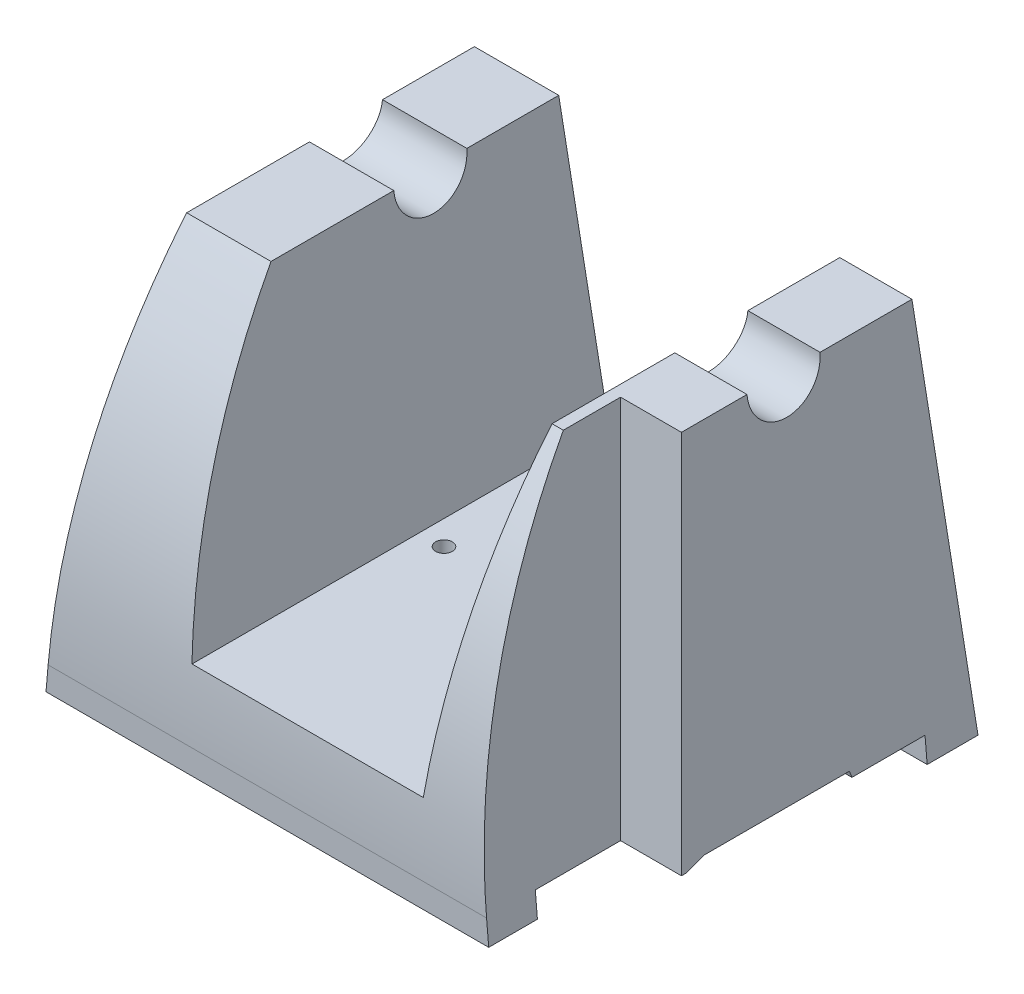
ISO-10303-21;
HEADER;
FILE_DESCRIPTION(('STEP AP214'),'2;1');
FILE_NAME('part.step','',(''),(''),'','','');
FILE_SCHEMA(('AUTOMOTIVE_DESIGN { 1 0 10303 214 1 1 1 1 }'));
ENDSEC;
DATA;
#1=APPLICATION_CONTEXT('core data for automotive mechanical design processes');
#2=APPLICATION_PROTOCOL_DEFINITION('international standard','automotive_design',2000,#1);
#3=PRODUCT_CONTEXT('',#1,'mechanical');
#4=PRODUCT('Part','Part','',(#3));
#5=PRODUCT_RELATED_PRODUCT_CATEGORY('part','',(#4));
#6=PRODUCT_DEFINITION_FORMATION('','',#4);
#7=PRODUCT_DEFINITION_CONTEXT('part definition',#1,'design');
#8=PRODUCT_DEFINITION('design','',#6,#7);
#9=PRODUCT_DEFINITION_SHAPE('','',#8);
#10=(LENGTH_UNIT() NAMED_UNIT(*) SI_UNIT(.MILLI.,.METRE.));
#11=(NAMED_UNIT(*) PLANE_ANGLE_UNIT() SI_UNIT($,.RADIAN.));
#12=(NAMED_UNIT(*) SI_UNIT($,.STERADIAN.) SOLID_ANGLE_UNIT());
#13=UNCERTAINTY_MEASURE_WITH_UNIT(LENGTH_MEASURE(1.E-05),#10,'distance_accuracy_value','');
#14=(GEOMETRIC_REPRESENTATION_CONTEXT(3) GLOBAL_UNCERTAINTY_ASSIGNED_CONTEXT((#13)) GLOBAL_UNIT_ASSIGNED_CONTEXT((#10,
#11,#12)) REPRESENTATION_CONTEXT('',''));
#15=CARTESIAN_POINT('',(0.,0.,0.));
#16=DIRECTION('',(0.,0.,1.));
#17=DIRECTION('',(1.,0.,0.));
#18=AXIS2_PLACEMENT_3D('',#15,#16,#17);
#19=CARTESIAN_POINT('',(130.175,98.425,-79.1170571106695));
#20=DIRECTION('',(0.,-1.,0.));
#21=DIRECTION('',(0.,0.,-1.));
#22=AXIS2_PLACEMENT_3D('',#19,#20,#21);
#23=PLANE('',#22);
#24=DIRECTION('',(1.,0.,0.));
#25=VECTOR('',#24,1.);
#26=CARTESIAN_POINT('',(130.175,98.425,-103.069481305851));
#27=LINE('',#26,#25);
#28=CARTESIAN_POINT('',(122.119481305851,98.425,-103.069481305851));
#29=VERTEX_POINT('',#28);
#30=CARTESIAN_POINT('',(103.305518694149,98.425,-103.069481305851));
#31=VERTEX_POINT('',#30);
#32=EDGE_CURVE('E272',#29,#31,#27,.F.);
#33=ORIENTED_EDGE('',*,*,#32,.T.);
#34=DIRECTION('',(0.,0.,1.));
#35=VECTOR('',#34,1.);
#36=CARTESIAN_POINT('',(103.305518694149,98.425,-36.1749068721041));
#37=LINE('',#36,#35);
#38=CARTESIAN_POINT('',(103.305518694149,98.425,-79.1170571106695));
#39=VERTEX_POINT('',#38);
#40=EDGE_CURVE('E268',#39,#31,#37,.F.);
#41=ORIENTED_EDGE('',*,*,#40,.F.);
#42=DIRECTION('',(-1.,0.,0.));
#43=VECTOR('',#42,1.);
#44=CARTESIAN_POINT('',(130.175,98.425,-79.1170571106695));
#45=LINE('',#44,#43);
#46=CARTESIAN_POINT('',(122.119481305851,98.425,-79.1170571106695));
#47=VERTEX_POINT('',#46);
#48=EDGE_CURVE('E273',#47,#39,#45,.T.);
#49=ORIENTED_EDGE('',*,*,#48,.F.);
#50=DIRECTION('',(0.,0.,-1.));
#51=VECTOR('',#50,1.);
#52=CARTESIAN_POINT('',(122.119481305851,98.425,-36.1749068721041));
#53=LINE('',#52,#51);
#54=EDGE_CURVE('E342',#29,#47,#53,.F.);
#55=ORIENTED_EDGE('',*,*,#54,.F.);
#56=EDGE_LOOP('',(#33,#41,#49,#55));
#57=FACE_BOUND('',#56,.T.);
#58=ADVANCED_FACE('F45',(#57),#23,.F.);
#59=CARTESIAN_POINT('',(130.175,98.425,-69.5920571106695));
#60=DIRECTION('',(-1.,0.,0.));
#61=DIRECTION('',(0.,0.,1.));
#62=AXIS2_PLACEMENT_3D('',#59,#60,#61);
#63=CYLINDRICAL_SURFACE('',#62,9.52500000000001);
#64=ORIENTED_EDGE('',*,*,#48,.T.);
#65=CARTESIAN_POINT('',(103.305518694149,98.425,-69.5920571106695));
#66=DIRECTION('',(-0.996194698091746,0.0871557427476582,0.));
#67=DIRECTION('',(-0.0871557427476582,-0.996194698091746,0.));
#68=AXIS2_PLACEMENT_3D('',#65,#66,#67);
#69=ELLIPSE('',#68,9.56138395260039,9.52500000000001);
#70=CARTESIAN_POINT('',(103.305518694149,98.425,-60.0670571106695));
#71=VERTEX_POINT('',#70);
#72=EDGE_CURVE('E250',#39,#71,#69,.T.);
#73=ORIENTED_EDGE('',*,*,#72,.T.);
#74=DIRECTION('',(-1.,0.,0.));
#75=VECTOR('',#74,1.);
#76=CARTESIAN_POINT('',(130.175,98.425,-60.0670571106695));
#77=LINE('',#76,#75);
#78=CARTESIAN_POINT('',(122.119481305851,98.425,-60.0670571106695));
#79=VERTEX_POINT('',#78);
#80=EDGE_CURVE('E373',#79,#71,#77,.T.);
#81=ORIENTED_EDGE('',*,*,#80,.F.);
#82=CARTESIAN_POINT('',(122.119481305851,98.425,-69.5920571106695));
#83=DIRECTION('',(0.996194698091746,0.0871557427476582,0.));
#84=DIRECTION('',(-0.0871557427476582,0.996194698091746,0.));
#85=AXIS2_PLACEMENT_3D('',#82,#83,#84);
#86=ELLIPSE('',#85,9.56138395260039,9.52500000000001);
#87=EDGE_CURVE('E340',#47,#79,#86,.F.);
#88=ORIENTED_EDGE('',*,*,#87,.F.);
#89=EDGE_LOOP('',(#64,#73,#81,#88));
#90=FACE_BOUND('',#89,.T.);
#91=ADVANCED_FACE('F371',(#90),#63,.F.);
#92=CARTESIAN_POINT('',(130.175,98.425,-28.059114221339));
#93=DIRECTION('',(0.,-1.,0.));
#94=DIRECTION('',(0.,0.,-1.));
#95=AXIS2_PLACEMENT_3D('',#92,#93,#94);
#96=PLANE('',#95);
#97=DIRECTION('',(-1.,0.,0.));
#98=VECTOR('',#97,1.);
#99=CARTESIAN_POINT('',(130.175,98.425,-28.059114221339));
#100=LINE('',#99,#98);
#101=CARTESIAN_POINT('',(106.244481305851,98.425,-28.059114221339));
#102=VERTEX_POINT('',#101);
#103=CARTESIAN_POINT('',(103.305518694149,98.425,-28.059114221339));
#104=VERTEX_POINT('',#103);
#105=EDGE_CURVE('E445',#102,#104,#100,.T.);
#106=ORIENTED_EDGE('',*,*,#105,.F.);
#107=DIRECTION('',(0.,0.,-1.));
#108=VECTOR('',#107,1.);
#109=CARTESIAN_POINT('',(106.244481305851,98.425,-36.1749068721041));
#110=LINE('',#109,#108);
#111=CARTESIAN_POINT('',(106.244481305851,98.425,-42.9805186941495));
#112=VERTEX_POINT('',#111);
#113=EDGE_CURVE('E328',#112,#102,#110,.F.);
#114=ORIENTED_EDGE('',*,*,#113,.F.);
#115=DIRECTION('',(1.,0.,0.));
#116=VECTOR('',#115,1.);
#117=CARTESIAN_POINT('',(130.175,98.425,-42.9805186941495));
#118=LINE('',#117,#116);
#119=CARTESIAN_POINT('',(122.119481305851,98.425,-42.9805186941495));
#120=VERTEX_POINT('',#119);
#121=EDGE_CURVE('E333',#120,#112,#118,.F.);
#122=ORIENTED_EDGE('',*,*,#121,.F.);
#123=DIRECTION('',(0.,0.,-1.));
#124=VECTOR('',#123,1.);
#125=CARTESIAN_POINT('',(122.119481305851,98.425,-36.1749068721041));
#126=LINE('',#125,#124);
#127=EDGE_CURVE('E337',#79,#120,#126,.F.);
#128=ORIENTED_EDGE('',*,*,#127,.F.);
#129=ORIENTED_EDGE('',*,*,#80,.T.);
#130=DIRECTION('',(0.,0.,1.));
#131=VECTOR('',#130,1.);
#132=CARTESIAN_POINT('',(103.305518694149,98.425,-36.1749068721041));
#133=LINE('',#132,#131);
#134=EDGE_CURVE('E346',#104,#71,#133,.F.);
#135=ORIENTED_EDGE('',*,*,#134,.F.);
#136=EDGE_LOOP('',(#106,#114,#122,#128,#129,#135));
#137=FACE_BOUND('',#136,.T.);
#138=ADVANCED_FACE('F378',(#137),#96,.F.);
#139=CARTESIAN_POINT('',(130.175,0.,-12.7));
#140=DIRECTION('',(0.,1.,0.));
#141=DIRECTION('',(0.,0.,1.));
#142=AXIS2_PLACEMENT_3D('',#139,#140,#141);
#143=PLANE('',#142);
#144=DIRECTION('',(-1.,0.,0.));
#145=VECTOR('',#144,1.);
#146=CARTESIAN_POINT('',(130.175,0.,-12.7));
#147=LINE('',#146,#145);
#148=CARTESIAN_POINT('',(114.85555301339,0.,-12.7));
#149=VERTEX_POINT('',#148);
#150=CARTESIAN_POINT('',(-0.555553013389637,0.,-12.7));
#151=VERTEX_POINT('',#150);
#152=EDGE_CURVE('E137',#149,#151,#147,.T.);
#153=ORIENTED_EDGE('',*,*,#152,.F.);
#154=DIRECTION('',(0.,0.,-1.));
#155=VECTOR('',#154,1.);
#156=CARTESIAN_POINT('',(114.85555301339,0.,-12.7));
#157=LINE('',#156,#155);
#158=CARTESIAN_POINT('',(114.85555301339,0.,0.));
#159=VERTEX_POINT('',#158);
#160=EDGE_CURVE('E263',#149,#159,#157,.F.);
#161=ORIENTED_EDGE('',*,*,#160,.T.);
#162=DIRECTION('',(-1.,0.,0.));
#163=VECTOR('',#162,1.);
#164=CARTESIAN_POINT('',(130.175,0.,0.));
#165=LINE('',#164,#163);
#166=CARTESIAN_POINT('',(-0.555553013389637,0.,0.));
#167=VERTEX_POINT('',#166);
#168=EDGE_CURVE('E196',#159,#167,#165,.T.);
#169=ORIENTED_EDGE('',*,*,#168,.T.);
#170=DIRECTION('',(0.,0.,-1.));
#171=VECTOR('',#170,1.);
#172=CARTESIAN_POINT('',(-0.555553013389618,0.,-36.1749068721041));
#173=LINE('',#172,#171);
#174=EDGE_CURVE('E236',#167,#151,#173,.T.);
#175=ORIENTED_EDGE('',*,*,#174,.T.);
#176=EDGE_LOOP('',(#153,#161,#169,#175));
#177=FACE_BOUND('',#176,.T.);
#178=ADVANCED_FACE('F453',(#177),#143,.F.);
#179=CARTESIAN_POINT('',(130.175,6.35,-12.7));
#180=DIRECTION('',(0.,0.,1.));
#181=DIRECTION('',(1.,0.,0.));
#182=AXIS2_PLACEMENT_3D('',#179,#180,#181);
#183=PLANE('',#182);
#184=DIRECTION('',(-1.,0.,0.));
#185=VECTOR('',#184,1.);
#186=CARTESIAN_POINT('',(130.175,6.35,-12.7));
#187=LINE('',#186,#185);
#188=CARTESIAN_POINT('',(114.3,6.35,-12.7));
#189=VERTEX_POINT('',#188);
#190=CARTESIAN_POINT('',(0.,6.35,-12.7));
#191=VERTEX_POINT('',#190);
#192=EDGE_CURVE('E391',#189,#191,#187,.T.);
#193=ORIENTED_EDGE('',*,*,#192,.F.);
#194=DIRECTION('',(-0.0871557427476582,0.996194698091746,0.));
#195=VECTOR('',#194,1.);
#196=CARTESIAN_POINT('',(114.420588460466,4.97166758976874,-12.7));
#197=LINE('',#196,#195);
#198=EDGE_CURVE('E244',#189,#149,#197,.F.);
#199=ORIENTED_EDGE('',*,*,#198,.T.);
#200=ORIENTED_EDGE('',*,*,#152,.T.);
#201=DIRECTION('',(0.0871557427476582,0.996194698091746,0.));
#202=VECTOR('',#201,1.);
#203=CARTESIAN_POINT('',(0.,6.35,-12.7));
#204=LINE('',#203,#202);
#205=EDGE_CURVE('E288',#151,#191,#204,.T.);
#206=ORIENTED_EDGE('',*,*,#205,.T.);
#207=EDGE_LOOP('',(#193,#199,#200,#206));
#208=FACE_BOUND('',#207,.T.);
#209=ADVANCED_FACE('F451',(#208),#183,.F.);
#210=CARTESIAN_POINT('',(130.175,6.35,-36.1749068721041));
#211=DIRECTION('',(0.,1.,0.));
#212=DIRECTION('',(0.,0.,1.));
#213=AXIS2_PLACEMENT_3D('',#210,#211,#212);
#214=PLANE('',#213);
#215=DIRECTION('',(1.,0.,0.));
#216=VECTOR('',#215,1.);
#217=CARTESIAN_POINT('',(130.175,6.35,-34.925));
#218=LINE('',#217,#216);
#219=CARTESIAN_POINT('',(130.175,6.35,-34.925));
#220=VERTEX_POINT('',#219);
#221=CARTESIAN_POINT('',(114.3,6.35,-34.925));
#222=VERTEX_POINT('',#221);
#223=EDGE_CURVE('E64',#220,#222,#218,.F.);
#224=ORIENTED_EDGE('',*,*,#223,.T.);
#225=DIRECTION('',(0.,0.,-1.));
#226=VECTOR('',#225,1.);
#227=CARTESIAN_POINT('',(114.3,6.35,-36.1749068721041));
#228=LINE('',#227,#226);
#229=EDGE_CURVE('E323',#222,#189,#228,.F.);
#230=ORIENTED_EDGE('',*,*,#229,.T.);
#231=ORIENTED_EDGE('',*,*,#192,.T.);
#232=DIRECTION('',(0.,0.,-1.));
#233=VECTOR('',#232,1.);
#234=CARTESIAN_POINT('',(0.,6.35,-36.1749068721041));
#235=LINE('',#234,#233);
#236=CARTESIAN_POINT('',(0.,6.35,-36.1749068721041));
#237=VERTEX_POINT('',#236);
#238=EDGE_CURVE('E290',#191,#237,#235,.T.);
#239=ORIENTED_EDGE('',*,*,#238,.T.);
#240=DIRECTION('',(-1.,0.,0.));
#241=VECTOR('',#240,1.);
#242=CARTESIAN_POINT('',(130.175,6.35,-36.1749068721041));
#243=LINE('',#242,#241);
#244=CARTESIAN_POINT('',(130.175,6.35,-36.1749068721041));
#245=VERTEX_POINT('',#244);
#246=EDGE_CURVE('E387',#245,#237,#243,.T.);
#247=ORIENTED_EDGE('',*,*,#246,.F.);
#248=DIRECTION('',(0.,0.,1.));
#249=VECTOR('',#248,1.);
#250=CARTESIAN_POINT('',(130.175,6.35,-36.1749068721041));
#251=LINE('',#250,#249);
#252=EDGE_CURVE('E188',#220,#245,#251,.F.);
#253=ORIENTED_EDGE('',*,*,#252,.F.);
#254=EDGE_LOOP('',(#224,#230,#231,#239,#247,#253));
#255=FACE_BOUND('',#254,.T.);
#256=ADVANCED_FACE('F384',(#255),#214,.F.);
#257=CARTESIAN_POINT('',(130.175,7.9375,-40.8807953947292));
#258=DIRECTION('',(0.,0.947537254746192,0.319645351707248));
#259=DIRECTION('',(0.,-0.319645351707248,0.947537254746192));
#260=AXIS2_PLACEMENT_3D('',#257,#258,#259);
#261=PLANE('',#260);
#262=DIRECTION('',(0.0279544157373131,0.319520433970623,-0.947166956199386));
#263=VECTOR('',#262,1.);
#264=CARTESIAN_POINT('',(0.,6.35,-36.1749068721041));
#265=LINE('',#264,#263);
#266=CARTESIAN_POINT('',(0.138888253347402,7.9375,-40.8807953947292));
#267=VERTEX_POINT('',#266);
#268=EDGE_CURVE('E292',#237,#267,#265,.T.);
#269=ORIENTED_EDGE('',*,*,#268,.T.);
#270=DIRECTION('',(-1.,0.,0.));
#271=VECTOR('',#270,1.);
#272=CARTESIAN_POINT('',(130.175,7.9375,-40.8807953947292));
#273=LINE('',#272,#271);
#274=CARTESIAN_POINT('',(130.036111746653,7.9375,-40.8807953947292));
#275=VERTEX_POINT('',#274);
#276=EDGE_CURVE('E392',#275,#267,#273,.T.);
#277=ORIENTED_EDGE('',*,*,#276,.F.);
#278=DIRECTION('',(0.0279544157373131,-0.319520433970623,0.947166956199386));
#279=VECTOR('',#278,1.);
#280=CARTESIAN_POINT('',(130.175,6.35,-36.1749068721041));
#281=LINE('',#280,#279);
#282=EDGE_CURVE('E185',#245,#275,#281,.F.);
#283=ORIENTED_EDGE('',*,*,#282,.F.);
#284=ORIENTED_EDGE('',*,*,#246,.T.);
#285=EDGE_LOOP('',(#269,#277,#283,#284));
#286=FACE_BOUND('',#285,.T.);
#287=ADVANCED_FACE('F394',(#286),#261,.F.);
#288=CARTESIAN_POINT('',(130.175,7.93750000000001,-78.8394674989891));
#289=DIRECTION('',(0.,1.,0.));
#290=DIRECTION('',(0.,0.,1.));
#291=AXIS2_PLACEMENT_3D('',#288,#289,#290);
#292=PLANE('',#291);
#293=CARTESIAN_POINT('',(42.8697084867889,7.93750000000001,-60.325));
#294=DIRECTION('',(0.,1.,0.));
#295=DIRECTION('',(0.,0.,1.));
#296=AXIS2_PLACEMENT_3D('',#293,#294,#295);
#297=CIRCLE('',#296,2.17842895301002);
#298=CARTESIAN_POINT('',(42.8697084867889,7.93750000000001,-58.14657104699));
#299=VERTEX_POINT('',#298);
#300=EDGE_CURVE('E336',#299,#299,#297,.T.);
#301=ORIENTED_EDGE('',*,*,#300,.T.);
#302=EDGE_LOOP('',(#301));
#303=FACE_BOUND('',#302,.T.);
#304=DIRECTION('',(0.,0.,-1.));
#305=VECTOR('',#304,1.);
#306=CARTESIAN_POINT('',(0.138888253347405,7.9375,-36.1749068721041));
#307=LINE('',#306,#305);
#308=CARTESIAN_POINT('',(0.138888253347402,7.93750000000001,-78.8394674989891));
#309=VERTEX_POINT('',#308);
#310=EDGE_CURVE('E294',#267,#309,#307,.T.);
#311=ORIENTED_EDGE('',*,*,#310,.T.);
#312=DIRECTION('',(-1.,0.,0.));
#313=VECTOR('',#312,1.);
#314=CARTESIAN_POINT('',(130.175,7.93750000000001,-78.8394674989891));
#315=LINE('',#314,#313);
#316=CARTESIAN_POINT('',(130.036111746653,7.93750000000001,-78.8394674989891));
#317=VERTEX_POINT('',#316);
#318=EDGE_CURVE('E399',#317,#309,#315,.T.);
#319=ORIENTED_EDGE('',*,*,#318,.F.);
#320=DIRECTION('',(0.,0.,1.));
#321=VECTOR('',#320,1.);
#322=CARTESIAN_POINT('',(130.036111746653,7.9375,-36.1749068721041));
#323=LINE('',#322,#321);
#324=EDGE_CURVE('E317',#275,#317,#323,.F.);
#325=ORIENTED_EDGE('',*,*,#324,.F.);
#326=ORIENTED_EDGE('',*,*,#276,.T.);
#327=EDGE_LOOP('',(#311,#319,#325,#326));
#328=FACE_BOUND('',#327,.T.);
#329=ADVANCED_FACE('F402',(#303,#328),#292,.F.);
#330=CARTESIAN_POINT('',(130.175,6.34999999999999,-79.375));
#331=DIRECTION('',(0.,0.319645351707247,-0.947537254746192));
#332=DIRECTION('',(0.,0.947537254746192,0.319645351707247));
#333=AXIS2_PLACEMENT_3D('',#330,#331,#332);
#334=PLANE('',#333);
#335=DIRECTION('',(-0.0826153791601821,-0.94429810481334,-0.318552646154687));
#336=VECTOR('',#335,1.);
#337=CARTESIAN_POINT('',(1.13691186912372,19.3449621277143,-74.9912364920963));
#338=LINE('',#337,#336);
#339=CARTESIAN_POINT('',(0.,6.34999999999999,-79.375));
#340=VERTEX_POINT('',#339);
#341=EDGE_CURVE('E296',#309,#340,#338,.T.);
#342=ORIENTED_EDGE('',*,*,#341,.T.);
#343=DIRECTION('',(-1.,0.,0.));
#344=VECTOR('',#343,1.);
#345=CARTESIAN_POINT('',(130.175,6.34999999999999,-79.375));
#346=LINE('',#345,#344);
#347=CARTESIAN_POINT('',(130.175,6.34999999999999,-79.375));
#348=VERTEX_POINT('',#347);
#349=EDGE_CURVE('E410',#348,#340,#346,.T.);
#350=ORIENTED_EDGE('',*,*,#349,.F.);
#351=DIRECTION('',(-0.0826153791601821,0.94429810481334,0.318552646154687));
#352=VECTOR('',#351,1.);
#353=CARTESIAN_POINT('',(129.038088130876,19.3449621277143,-74.9912364920963));
#354=LINE('',#353,#352);
#355=EDGE_CURVE('E315',#317,#348,#354,.F.);
#356=ORIENTED_EDGE('',*,*,#355,.F.);
#357=ORIENTED_EDGE('',*,*,#318,.T.);
#358=EDGE_LOOP('',(#342,#350,#356,#357));
#359=FACE_BOUND('',#358,.T.);
#360=ADVANCED_FACE('F411',(#359),#334,.F.);
#361=CARTESIAN_POINT('',(130.175,6.34999999999999,-98.425));
#362=DIRECTION('',(0.,1.,0.));
#363=DIRECTION('',(0.,0.,1.));
#364=AXIS2_PLACEMENT_3D('',#361,#362,#363);
#365=PLANE('',#364);
#366=DIRECTION('',(0.,0.,-1.));
#367=VECTOR('',#366,1.);
#368=CARTESIAN_POINT('',(0.,6.35,-36.1749068721041));
#369=LINE('',#368,#367);
#370=CARTESIAN_POINT('',(0.,6.34999999999999,-98.425));
#371=VERTEX_POINT('',#370);
#372=EDGE_CURVE('E298',#340,#371,#369,.T.);
#373=ORIENTED_EDGE('',*,*,#372,.T.);
#374=DIRECTION('',(-1.,0.,0.));
#375=VECTOR('',#374,1.);
#376=CARTESIAN_POINT('',(130.175,6.34999999999999,-98.425));
#377=LINE('',#376,#375);
#378=CARTESIAN_POINT('',(130.175,6.34999999999999,-98.425));
#379=VERTEX_POINT('',#378);
#380=EDGE_CURVE('E415',#379,#371,#377,.T.);
#381=ORIENTED_EDGE('',*,*,#380,.F.);
#382=DIRECTION('',(0.,0.,1.));
#383=VECTOR('',#382,1.);
#384=CARTESIAN_POINT('',(130.175,6.35,-36.1749068721041));
#385=LINE('',#384,#383);
#386=EDGE_CURVE('E313',#348,#379,#385,.F.);
#387=ORIENTED_EDGE('',*,*,#386,.F.);
#388=ORIENTED_EDGE('',*,*,#349,.T.);
#389=EDGE_LOOP('',(#373,#381,#387,#388));
#390=FACE_BOUND('',#389,.T.);
#391=ADVANCED_FACE('F417',(#390),#365,.F.);
#392=CARTESIAN_POINT('',(130.175,0.,-98.425));
#393=DIRECTION('',(0.,0.,-1.));
#394=DIRECTION('',(-1.,0.,0.));
#395=AXIS2_PLACEMENT_3D('',#392,#393,#394);
#396=PLANE('',#395);
#397=DIRECTION('',(-0.0871557427476582,-0.996194698091746,0.));
#398=VECTOR('',#397,1.);
#399=CARTESIAN_POINT('',(0.,6.35,-98.425));
#400=LINE('',#399,#398);
#401=CARTESIAN_POINT('',(-0.555553013389637,0.,-98.425));
#402=VERTEX_POINT('',#401);
#403=EDGE_CURVE('E300',#371,#402,#400,.T.);
#404=ORIENTED_EDGE('',*,*,#403,.T.);
#405=DIRECTION('',(-1.,0.,0.));
#406=VECTOR('',#405,1.);
#407=CARTESIAN_POINT('',(130.175,0.,-98.425));
#408=LINE('',#407,#406);
#409=CARTESIAN_POINT('',(130.73055301339,0.,-98.425));
#410=VERTEX_POINT('',#409);
#411=EDGE_CURVE('E307',#410,#402,#408,.T.);
#412=ORIENTED_EDGE('',*,*,#411,.F.);
#413=DIRECTION('',(-0.0871557427476582,0.996194698091746,0.));
#414=VECTOR('',#413,1.);
#415=CARTESIAN_POINT('',(130.175,6.35,-98.425));
#416=LINE('',#415,#414);
#417=EDGE_CURVE('E311',#379,#410,#416,.F.);
#418=ORIENTED_EDGE('',*,*,#417,.F.);
#419=ORIENTED_EDGE('',*,*,#380,.T.);
#420=EDGE_LOOP('',(#404,#412,#418,#419));
#421=FACE_BOUND('',#420,.T.);
#422=ADVANCED_FACE('F424',(#421),#396,.F.);
#423=CARTESIAN_POINT('',(130.175,0.,-111.125));
#424=DIRECTION('',(0.,1.,0.));
#425=DIRECTION('',(0.,0.,1.));
#426=AXIS2_PLACEMENT_3D('',#423,#424,#425);
#427=PLANE('',#426);
#428=DIRECTION('',(0.,0.,-1.));
#429=VECTOR('',#428,1.);
#430=CARTESIAN_POINT('',(-0.555553013389621,0.,-36.1749068721041));
#431=LINE('',#430,#429);
#432=CARTESIAN_POINT('',(-0.555553013389617,0.,-111.68055301339));
#433=VERTEX_POINT('',#432);
#434=EDGE_CURVE('E302',#402,#433,#431,.T.);
#435=ORIENTED_EDGE('',*,*,#434,.T.);
#436=DIRECTION('',(1.,0.,0.));
#437=VECTOR('',#436,1.);
#438=CARTESIAN_POINT('',(130.175,0.,-111.68055301339));
#439=LINE('',#438,#437);
#440=CARTESIAN_POINT('',(130.73055301339,0.,-111.68055301339));
#441=VERTEX_POINT('',#440);
#442=EDGE_CURVE('E304',#441,#433,#439,.F.);
#443=ORIENTED_EDGE('',*,*,#442,.F.);
#444=DIRECTION('',(0.,0.,1.));
#445=VECTOR('',#444,1.);
#446=CARTESIAN_POINT('',(130.73055301339,0.,-36.1749068721041));
#447=LINE('',#446,#445);
#448=EDGE_CURVE('E308',#410,#441,#447,.F.);
#449=ORIENTED_EDGE('',*,*,#448,.F.);
#450=ORIENTED_EDGE('',*,*,#411,.T.);
#451=EDGE_LOOP('',(#435,#443,#449,#450));
#452=FACE_BOUND('',#451,.T.);
#453=ADVANCED_FACE('F429',(#452),#427,.F.);
#454=CARTESIAN_POINT('',(130.175,6.34999999999999,-111.125));
#455=DIRECTION('',(0.,0.0871557427476581,-0.996194698091746));
#456=DIRECTION('',(0.,0.996194698091746,0.0871557427476581));
#457=AXIS2_PLACEMENT_3D('',#454,#455,#456);
#458=PLANE('',#457);
#459=DIRECTION('',(-1.,0.,0.));
#460=VECTOR('',#459,1.);
#461=CARTESIAN_POINT('',(130.175,24.3210920849702,-109.552733171385));
#462=LINE('',#461,#460);
#463=CARTESIAN_POINT('',(36.5277331713846,24.3210920849702,-109.552733171385));
#464=VERTEX_POINT('',#463);
#465=CARTESIAN_POINT('',(96.8222668286153,24.3210920849702,-109.552733171385));
#466=VERTEX_POINT('',#465);
#467=EDGE_CURVE('E229',#464,#466,#462,.F.);
#468=ORIENTED_EDGE('',*,*,#467,.T.);
#469=DIRECTION('',(0.0868265938642476,0.992432509138967,0.0868265938642476));
#470=VECTOR('',#469,1.);
#471=CARTESIAN_POINT('',(95.5132945947672,9.35947098922333,-110.861705405233));
#472=LINE('',#471,#470);
#473=EDGE_CURVE('E129',#466,#31,#472,.T.);
#474=ORIENTED_EDGE('',*,*,#473,.T.);
#475=ORIENTED_EDGE('',*,*,#32,.F.);
#476=DIRECTION('',(-0.0868265938642476,0.992432509138967,0.0868265938642476));
#477=VECTOR('',#476,1.);
#478=CARTESIAN_POINT('',(129.609961935637,12.8084146287184,-110.559961935637));
#479=LINE('',#478,#477);
#480=EDGE_CURVE('E310',#441,#29,#479,.T.);
#481=ORIENTED_EDGE('',*,*,#480,.F.);
#482=ORIENTED_EDGE('',*,*,#442,.T.);
#483=DIRECTION('',(-0.0868265938642476,-0.992432509138967,-0.0868265938642476));
#484=VECTOR('',#483,1.);
#485=CARTESIAN_POINT('',(0.565038064362849,12.8084146287184,-110.559961935637));
#486=LINE('',#485,#484);
#487=CARTESIAN_POINT('',(8.05551869414946,98.425,-103.069481305851));
#488=VERTEX_POINT('',#487);
#489=EDGE_CURVE('E258',#433,#488,#486,.F.);
#490=ORIENTED_EDGE('',*,*,#489,.T.);
#491=DIRECTION('',(1.,0.,0.));
#492=VECTOR('',#491,1.);
#493=CARTESIAN_POINT('',(130.175,98.425,-103.069481305851));
#494=LINE('',#493,#492);
#495=CARTESIAN_POINT('',(30.0444813058505,98.425,-103.069481305851));
#496=VERTEX_POINT('',#495);
#497=EDGE_CURVE('E249',#496,#488,#494,.F.);
#498=ORIENTED_EDGE('',*,*,#497,.F.);
#499=DIRECTION('',(0.0868265938642476,-0.992432509138967,-0.0868265938642476));
#500=VECTOR('',#499,1.);
#501=CARTESIAN_POINT('',(38.7941402952953,-1.58405988067971,-111.819140295295));
#502=LINE('',#501,#500);
#503=EDGE_CURVE('E239',#496,#464,#502,.T.);
#504=ORIENTED_EDGE('',*,*,#503,.T.);
#505=EDGE_LOOP('',(#468,#474,#475,#481,#482,#490,#498,#504));
#506=FACE_BOUND('',#505,.T.);
#507=ADVANCED_FACE('F247',(#506),#458,.T.);
#508=CARTESIAN_POINT('',(30.0444813058505,98.425,-79.1170571106695));
#509=VERTEX_POINT('',#508);
#510=CARTESIAN_POINT('',(8.05551869414944,98.425,-79.1170571106695));
#511=VERTEX_POINT('',#510);
#512=EDGE_CURVE('E368',#509,#511,#45,.T.);
#513=ORIENTED_EDGE('',*,*,#512,.F.);
#514=DIRECTION('',(0.,0.,1.));
#515=VECTOR('',#514,1.);
#516=CARTESIAN_POINT('',(30.0444813058505,98.425,-79.1170571106695));
#517=LINE('',#516,#515);
#518=EDGE_CURVE('E243',#509,#496,#517,.F.);
#519=ORIENTED_EDGE('',*,*,#518,.T.);
#520=ORIENTED_EDGE('',*,*,#497,.T.);
#521=DIRECTION('',(0.,0.,1.));
#522=VECTOR('',#521,1.);
#523=CARTESIAN_POINT('',(8.05551869414945,98.425,-36.1749068721041));
#524=LINE('',#523,#522);
#525=EDGE_CURVE('E274',#488,#511,#524,.T.);
#526=ORIENTED_EDGE('',*,*,#525,.T.);
#527=EDGE_LOOP('',(#513,#519,#520,#526));
#528=FACE_BOUND('',#527,.T.);
#529=ADVANCED_FACE('F439',(#528),#23,.F.);
#530=CARTESIAN_POINT('',(30.0444813058505,98.425,-60.0670571106695));
#531=VERTEX_POINT('',#530);
#532=CARTESIAN_POINT('',(8.05551869414944,98.425,-60.0670571106695));
#533=VERTEX_POINT('',#532);
#534=EDGE_CURVE('E443',#531,#533,#77,.T.);
#535=ORIENTED_EDGE('',*,*,#534,.F.);
#536=CARTESIAN_POINT('',(30.0444813058505,98.425,-69.5920571106695));
#537=DIRECTION('',(0.996194698091746,0.0871557427476582,0.));
#538=DIRECTION('',(-0.0871557427476582,0.996194698091746,0.));
#539=AXIS2_PLACEMENT_3D('',#536,#537,#538);
#540=ELLIPSE('',#539,9.56138395260039,9.52500000000001);
#541=EDGE_CURVE('E251',#531,#509,#540,.T.);
#542=ORIENTED_EDGE('',*,*,#541,.T.);
#543=ORIENTED_EDGE('',*,*,#512,.T.);
#544=CARTESIAN_POINT('',(8.05551869414944,98.425,-69.5920571106695));
#545=DIRECTION('',(-0.996194698091746,0.0871557427476582,0.));
#546=DIRECTION('',(-0.0871557427476582,-0.996194698091746,0.));
#547=AXIS2_PLACEMENT_3D('',#544,#545,#546);
#548=ELLIPSE('',#547,9.56138395260039,9.52500000000001);
#549=EDGE_CURVE('E277',#511,#533,#548,.T.);
#550=ORIENTED_EDGE('',*,*,#549,.T.);
#551=EDGE_LOOP('',(#535,#542,#543,#550));
#552=FACE_BOUND('',#551,.T.);
#553=ADVANCED_FACE('F442',(#552),#63,.F.);
#554=CARTESIAN_POINT('',(30.0444813058505,98.425,-28.059114221339));
#555=VERTEX_POINT('',#554);
#556=CARTESIAN_POINT('',(8.05551869414944,98.425,-28.059114221339));
#557=VERTEX_POINT('',#556);
#558=EDGE_CURVE('E447',#555,#557,#100,.T.);
#559=ORIENTED_EDGE('',*,*,#558,.F.);
#560=DIRECTION('',(0.,0.,1.));
#561=VECTOR('',#560,1.);
#562=CARTESIAN_POINT('',(30.0444813058505,98.425,-28.059114221339));
#563=LINE('',#562,#561);
#564=EDGE_CURVE('E266',#555,#531,#563,.F.);
#565=ORIENTED_EDGE('',*,*,#564,.T.);
#566=ORIENTED_EDGE('',*,*,#534,.T.);
#567=DIRECTION('',(0.,0.,1.));
#568=VECTOR('',#567,1.);
#569=CARTESIAN_POINT('',(8.05551869414945,98.425,-36.1749068721041));
#570=LINE('',#569,#568);
#571=EDGE_CURVE('E280',#533,#557,#570,.T.);
#572=ORIENTED_EDGE('',*,*,#571,.T.);
#573=EDGE_LOOP('',(#559,#565,#566,#572));
#574=FACE_BOUND('',#573,.T.);
#575=ADVANCED_FACE('F486',(#574),#96,.F.);
#576=CARTESIAN_POINT('',(130.175,6.35,-165.1));
#577=DIRECTION('',(-1.,0.,0.));
#578=DIRECTION('',(0.,0.,1.));
#579=AXIS2_PLACEMENT_3D('',#576,#577,#578);
#580=CYLINDRICAL_SURFACE('',#579,165.1);
#581=DIRECTION('',(-1.,0.,0.));
#582=VECTOR('',#581,1.);
#583=CARTESIAN_POINT('',(130.175,6.34999999999999,0.));
#584=LINE('',#583,#582);
#585=CARTESIAN_POINT('',(114.3,6.34999999999999,0.));
#586=VERTEX_POINT('',#585);
#587=CARTESIAN_POINT('',(0.,6.34999999999999,0.));
#588=VERTEX_POINT('',#587);
#589=EDGE_CURVE('E203',#586,#588,#584,.T.);
#590=ORIENTED_EDGE('',*,*,#589,.F.);
#591=CARTESIAN_POINT('',(114.3,6.35,-165.1));
#592=DIRECTION('',(0.996194698091746,0.0871557427476582,0.));
#593=DIRECTION('',(-0.0871557427476582,0.996194698091746,0.));
#594=AXIS2_PLACEMENT_3D('',#591,#592,#593);
#595=ELLIPSE('',#594,165.730655178407,165.1);
#596=EDGE_CURVE('E322',#586,#102,#595,.F.);
#597=ORIENTED_EDGE('',*,*,#596,.T.);
#598=ORIENTED_EDGE('',*,*,#105,.T.);
#599=CARTESIAN_POINT('',(95.25,6.35,-165.1));
#600=DIRECTION('',(-0.996194698091746,0.0871557427476582,0.));
#601=DIRECTION('',(-0.0871557427476582,-0.996194698091746,0.));
#602=AXIS2_PLACEMENT_3D('',#599,#600,#601);
#603=ELLIPSE('',#602,165.730655178407,165.1);
#604=CARTESIAN_POINT('',(96.8222668286153,24.3210920849702,-0.980988763417401));
#605=VERTEX_POINT('',#604);
#606=EDGE_CURVE('E55',#104,#605,#603,.F.);
#607=ORIENTED_EDGE('',*,*,#606,.T.);
#608=DIRECTION('',(-1.,0.,0.));
#609=VECTOR('',#608,1.);
#610=CARTESIAN_POINT('',(130.175,24.3210920849702,-0.980988763417401));
#611=LINE('',#610,#609);
#612=CARTESIAN_POINT('',(36.5277331713846,24.3210920849702,-0.980988763417401));
#613=VERTEX_POINT('',#612);
#614=EDGE_CURVE('E123',#605,#613,#611,.T.);
#615=ORIENTED_EDGE('',*,*,#614,.T.);
#616=CARTESIAN_POINT('',(38.1,6.35,-165.1));
#617=DIRECTION('',(0.996194698091746,0.0871557427476582,0.));
#618=DIRECTION('',(-0.0871557427476582,0.996194698091746,0.));
#619=AXIS2_PLACEMENT_3D('',#616,#617,#618);
#620=ELLIPSE('',#619,165.730655178407,165.1);
#621=EDGE_CURVE('E242',#613,#555,#620,.F.);
#622=ORIENTED_EDGE('',*,*,#621,.T.);
#623=ORIENTED_EDGE('',*,*,#558,.T.);
#624=CARTESIAN_POINT('',(0.,6.35,-165.1));
#625=DIRECTION('',(-0.996194698091746,0.0871557427476582,0.));
#626=DIRECTION('',(-0.0871557427476582,-0.996194698091746,0.));
#627=AXIS2_PLACEMENT_3D('',#624,#625,#626);
#628=ELLIPSE('',#627,165.730655178407,165.1);
#629=EDGE_CURVE('E283',#557,#588,#628,.F.);
#630=ORIENTED_EDGE('',*,*,#629,.T.);
#631=EDGE_LOOP('',(#590,#597,#598,#607,#615,#622,#623,#630));
#632=FACE_BOUND('',#631,.T.);
#633=ADVANCED_FACE('F509',(#632),#580,.T.);
#634=CARTESIAN_POINT('',(130.175,0.,0.));
#635=DIRECTION('',(0.,0.,-1.));
#636=DIRECTION('',(-1.,0.,0.));
#637=AXIS2_PLACEMENT_3D('',#634,#635,#636);
#638=PLANE('',#637);
#639=ORIENTED_EDGE('',*,*,#168,.F.);
#640=DIRECTION('',(0.0871557427476582,-0.996194698091746,0.));
#641=VECTOR('',#640,1.);
#642=CARTESIAN_POINT('',(114.971921424558,-1.33009702604502,0.));
#643=LINE('',#642,#641);
#644=EDGE_CURVE('E262',#159,#586,#643,.F.);
#645=ORIENTED_EDGE('',*,*,#644,.T.);
#646=ORIENTED_EDGE('',*,*,#589,.T.);
#647=DIRECTION('',(-0.0871557427476582,-0.996194698091746,0.));
#648=VECTOR('',#647,1.);
#649=CARTESIAN_POINT('',(0.,6.35,0.));
#650=LINE('',#649,#648);
#651=EDGE_CURVE('E285',#588,#167,#650,.T.);
#652=ORIENTED_EDGE('',*,*,#651,.T.);
#653=EDGE_LOOP('',(#639,#645,#646,#652));
#654=FACE_BOUND('',#653,.T.);
#655=ADVANCED_FACE('F454',(#654),#638,.F.);
#656=CARTESIAN_POINT('',(130.175,6.35,-36.1749068721041));
#657=DIRECTION('',(0.996194698091746,0.0871557427476582,0.));
#658=DIRECTION('',(-0.0871557427476582,0.996194698091746,0.));
#659=AXIS2_PLACEMENT_3D('',#656,#657,#658);
#660=PLANE('',#659);
#661=ORIENTED_EDGE('',*,*,#127,.T.);
#662=DIRECTION('',(0.0868265938642476,-0.992432509138967,0.0868265938642477));
#663=VECTOR('',#662,1.);
#664=CARTESIAN_POINT('',(130.165577130325,6.45770389322343,-34.9344228696746));
#665=LINE('',#664,#663);
#666=EDGE_CURVE('E13',#120,#220,#665,.T.);
#667=ORIENTED_EDGE('',*,*,#666,.T.);
#668=ORIENTED_EDGE('',*,*,#252,.T.);
#669=ORIENTED_EDGE('',*,*,#282,.T.);
#670=ORIENTED_EDGE('',*,*,#324,.T.);
#671=ORIENTED_EDGE('',*,*,#355,.T.);
#672=ORIENTED_EDGE('',*,*,#386,.T.);
#673=ORIENTED_EDGE('',*,*,#417,.T.);
#674=ORIENTED_EDGE('',*,*,#448,.T.);
#675=ORIENTED_EDGE('',*,*,#480,.T.);
#676=ORIENTED_EDGE('',*,*,#54,.T.);
#677=ORIENTED_EDGE('',*,*,#87,.T.);
#678=EDGE_LOOP('',(#661,#667,#668,#669,#670,#671,#672,#673,#674,#675,#676,#677));
#679=FACE_BOUND('',#678,.T.);
#680=ADVANCED_FACE('F358',(#679),#660,.T.);
#681=CARTESIAN_POINT('',(0.,6.35,-36.1749068721041));
#682=DIRECTION('',(-0.996194698091746,0.0871557427476582,0.));
#683=DIRECTION('',(-0.0871557427476582,-0.996194698091746,0.));
#684=AXIS2_PLACEMENT_3D('',#681,#682,#683);
#685=PLANE('',#684);
#686=ORIENTED_EDGE('',*,*,#174,.F.);
#687=ORIENTED_EDGE('',*,*,#651,.F.);
#688=ORIENTED_EDGE('',*,*,#629,.F.);
#689=ORIENTED_EDGE('',*,*,#571,.F.);
#690=ORIENTED_EDGE('',*,*,#549,.F.);
#691=ORIENTED_EDGE('',*,*,#525,.F.);
#692=ORIENTED_EDGE('',*,*,#489,.F.);
#693=ORIENTED_EDGE('',*,*,#434,.F.);
#694=ORIENTED_EDGE('',*,*,#403,.F.);
#695=ORIENTED_EDGE('',*,*,#372,.F.);
#696=ORIENTED_EDGE('',*,*,#341,.F.);
#697=ORIENTED_EDGE('',*,*,#310,.F.);
#698=ORIENTED_EDGE('',*,*,#268,.F.);
#699=ORIENTED_EDGE('',*,*,#238,.F.);
#700=ORIENTED_EDGE('',*,*,#205,.F.);
#701=EDGE_LOOP('',(#686,#687,#688,#689,#690,#691,#692,#693,#694,#695,#696,#697,#698,#699,#700));
#702=FACE_BOUND('',#701,.T.);
#703=ADVANCED_FACE('F434',(#702),#685,.T.);
#704=CARTESIAN_POINT('',(0.,24.3210920849702,0.));
#705=DIRECTION('',(0.,-1.,0.));
#706=DIRECTION('',(0.,0.,-1.));
#707=AXIS2_PLACEMENT_3D('',#704,#705,#706);
#708=PLANE('',#707);
#709=CARTESIAN_POINT('',(42.8697084867889,24.3210920849702,-60.325));
#710=DIRECTION('',(0.,-1.,0.));
#711=DIRECTION('',(0.,0.,-1.));
#712=AXIS2_PLACEMENT_3D('',#709,#710,#711);
#713=CIRCLE('',#712,2.17842895301002);
#714=CARTESIAN_POINT('',(42.8697084867889,24.3210920849702,-62.50342895301));
#715=VERTEX_POINT('',#714);
#716=EDGE_CURVE('E49',#715,#715,#713,.T.);
#717=ORIENTED_EDGE('',*,*,#716,.T.);
#718=EDGE_LOOP('',(#717));
#719=FACE_BOUND('',#718,.T.);
#720=DIRECTION('',(0.,0.,1.));
#721=VECTOR('',#720,1.);
#722=CARTESIAN_POINT('',(36.5277331713846,24.3210920849702,0.));
#723=LINE('',#722,#721);
#724=EDGE_CURVE('E232',#613,#464,#723,.F.);
#725=ORIENTED_EDGE('',*,*,#724,.F.);
#726=ORIENTED_EDGE('',*,*,#614,.F.);
#727=DIRECTION('',(0.,0.,1.));
#728=VECTOR('',#727,1.);
#729=CARTESIAN_POINT('',(96.8222668286153,24.3210920849702,-36.1749068721041));
#730=LINE('',#729,#728);
#731=EDGE_CURVE('E233',#605,#466,#730,.F.);
#732=ORIENTED_EDGE('',*,*,#731,.T.);
#733=ORIENTED_EDGE('',*,*,#467,.F.);
#734=EDGE_LOOP('',(#725,#726,#732,#733));
#735=FACE_BOUND('',#734,.T.);
#736=ADVANCED_FACE('F231',(#719,#735),#708,.F.);
#737=CARTESIAN_POINT('',(95.25,6.35,-36.1749068721041));
#738=DIRECTION('',(-0.996194698091746,0.0871557427476582,0.));
#739=DIRECTION('',(-0.0871557427476582,-0.996194698091746,0.));
#740=AXIS2_PLACEMENT_3D('',#737,#738,#739);
#741=PLANE('',#740);
#742=ORIENTED_EDGE('',*,*,#731,.F.);
#743=ORIENTED_EDGE('',*,*,#606,.F.);
#744=ORIENTED_EDGE('',*,*,#134,.T.);
#745=ORIENTED_EDGE('',*,*,#72,.F.);
#746=ORIENTED_EDGE('',*,*,#40,.T.);
#747=ORIENTED_EDGE('',*,*,#473,.F.);
#748=EDGE_LOOP('',(#742,#743,#744,#745,#746,#747));
#749=FACE_BOUND('',#748,.T.);
#750=ADVANCED_FACE('F498',(#749),#741,.T.);
#751=CARTESIAN_POINT('',(38.1,6.35,-36.1749068721041));
#752=DIRECTION('',(0.996194698091746,0.0871557427476582,0.));
#753=DIRECTION('',(-0.0871557427476582,0.996194698091746,0.));
#754=AXIS2_PLACEMENT_3D('',#751,#752,#753);
#755=PLANE('',#754);
#756=ORIENTED_EDGE('',*,*,#518,.F.);
#757=ORIENTED_EDGE('',*,*,#541,.F.);
#758=ORIENTED_EDGE('',*,*,#564,.F.);
#759=ORIENTED_EDGE('',*,*,#621,.F.);
#760=ORIENTED_EDGE('',*,*,#724,.T.);
#761=ORIENTED_EDGE('',*,*,#503,.F.);
#762=EDGE_LOOP('',(#756,#757,#758,#759,#760,#761));
#763=FACE_BOUND('',#762,.T.);
#764=ADVANCED_FACE('F47',(#763),#755,.T.);
#765=CARTESIAN_POINT('',(114.3,6.35,-36.1749068721041));
#766=DIRECTION('',(0.996194698091746,0.0871557427476582,0.));
#767=DIRECTION('',(-0.0871557427476582,0.996194698091746,0.));
#768=AXIS2_PLACEMENT_3D('',#765,#766,#767);
#769=PLANE('',#768);
#770=ORIENTED_EDGE('',*,*,#229,.F.);
#771=DIRECTION('',(-0.0868265938642476,0.992432509138967,-0.0868265938642477));
#772=VECTOR('',#771,1.);
#773=CARTESIAN_POINT('',(114.419679361258,4.98205864126212,-34.8053206387422));
#774=LINE('',#773,#772);
#775=EDGE_CURVE('E261',#222,#112,#774,.T.);
#776=ORIENTED_EDGE('',*,*,#775,.T.);
#777=ORIENTED_EDGE('',*,*,#113,.T.);
#778=ORIENTED_EDGE('',*,*,#596,.F.);
#779=ORIENTED_EDGE('',*,*,#644,.F.);
#780=ORIENTED_EDGE('',*,*,#160,.F.);
#781=ORIENTED_EDGE('',*,*,#198,.F.);
#782=EDGE_LOOP('',(#770,#776,#777,#778,#779,#780,#781));
#783=FACE_BOUND('',#782,.T.);
#784=ADVANCED_FACE('F471',(#783),#769,.T.);
#785=CARTESIAN_POINT('',(130.175,6.35,-34.925));
#786=DIRECTION('',(0.,0.0871557427476583,0.996194698091746));
#787=DIRECTION('',(0.,-0.996194698091746,0.0871557427476583));
#788=AXIS2_PLACEMENT_3D('',#785,#786,#787);
#789=PLANE('',#788);
#790=ORIENTED_EDGE('',*,*,#666,.F.);
#791=ORIENTED_EDGE('',*,*,#121,.T.);
#792=ORIENTED_EDGE('',*,*,#775,.F.);
#793=ORIENTED_EDGE('',*,*,#223,.F.);
#794=EDGE_LOOP('',(#790,#791,#792,#793));
#795=FACE_BOUND('',#794,.T.);
#796=ADVANCED_FACE('F381',(#795),#789,.T.);
#797=CARTESIAN_POINT('',(42.8697084867889,0.,-60.325));
#798=DIRECTION('',(0.,1.,0.));
#799=DIRECTION('',(0.,0.,1.));
#800=AXIS2_PLACEMENT_3D('',#797,#798,#799);
#801=CYLINDRICAL_SURFACE('',#800,2.17842895301002);
#802=ORIENTED_EDGE('',*,*,#716,.F.);
#803=EDGE_LOOP('',(#802));
#804=FACE_BOUND('',#803,.T.);
#805=ORIENTED_EDGE('',*,*,#300,.F.);
#806=EDGE_LOOP('',(#805));
#807=FACE_BOUND('',#806,.T.);
#808=ADVANCED_FACE('F464',(#804,#807),#801,.F.);
#809=CLOSED_SHELL('',(#58,#91,#138,#178,#209,#256,#287,#329,#360,#391,#422,#453,#507,#529,#553,
#575,#633,#655,#680,#703,#736,#750,#764,#784,#796,#808));
#810=MANIFOLD_SOLID_BREP('B2',#809);
#811=ADVANCED_BREP_SHAPE_REPRESENTATION('',(#18,#810),#14);
#812=SHAPE_DEFINITION_REPRESENTATION(#9,#811);
ENDSEC;
END-ISO-10303-21;
